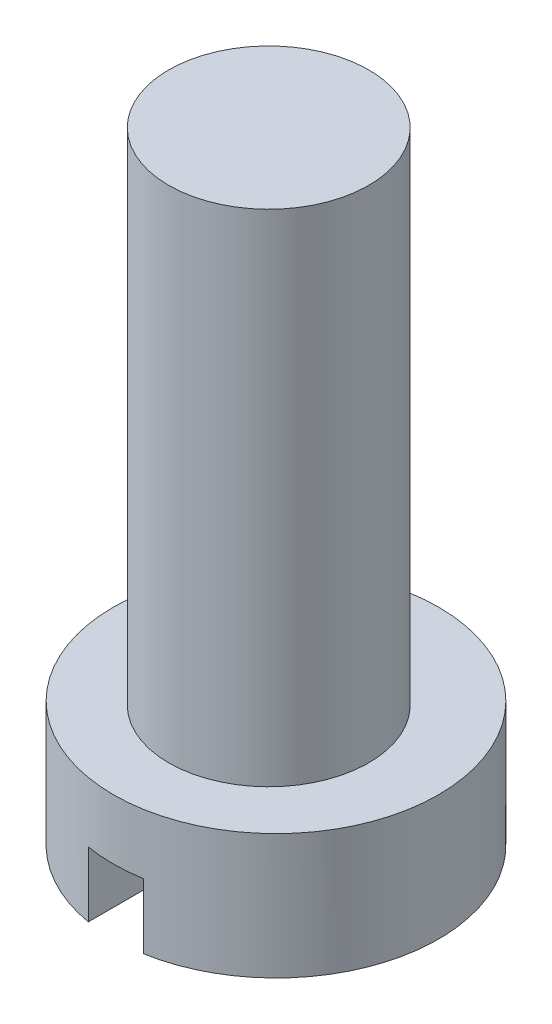
ISO-10303-21;
HEADER;
FILE_DESCRIPTION(('STEP AP214'),'2;1');
FILE_NAME('part.step','',(''),(''),'','','');
FILE_SCHEMA(('AUTOMOTIVE_DESIGN { 1 0 10303 214 1 1 1 1 }'));
ENDSEC;
DATA;
#1=APPLICATION_CONTEXT('core data for automotive mechanical design processes');
#2=APPLICATION_PROTOCOL_DEFINITION('international standard','automotive_design',2000,#1);
#3=PRODUCT_CONTEXT('',#1,'mechanical');
#4=PRODUCT('Part','Part','',(#3));
#5=PRODUCT_RELATED_PRODUCT_CATEGORY('part','',(#4));
#6=PRODUCT_DEFINITION_FORMATION('','',#4);
#7=PRODUCT_DEFINITION_CONTEXT('part definition',#1,'design');
#8=PRODUCT_DEFINITION('design','',#6,#7);
#9=PRODUCT_DEFINITION_SHAPE('','',#8);
#10=(LENGTH_UNIT() NAMED_UNIT(*) SI_UNIT(.MILLI.,.METRE.));
#11=(NAMED_UNIT(*) PLANE_ANGLE_UNIT() SI_UNIT($,.RADIAN.));
#12=(NAMED_UNIT(*) SI_UNIT($,.STERADIAN.) SOLID_ANGLE_UNIT());
#13=UNCERTAINTY_MEASURE_WITH_UNIT(LENGTH_MEASURE(1.E-05),#10,'distance_accuracy_value','');
#14=(GEOMETRIC_REPRESENTATION_CONTEXT(3) GLOBAL_UNCERTAINTY_ASSIGNED_CONTEXT((#13)) GLOBAL_UNIT_ASSIGNED_CONTEXT((#10,
#11,#12)) REPRESENTATION_CONTEXT('',''));
#15=CARTESIAN_POINT('',(0.,0.,0.));
#16=DIRECTION('',(0.,0.,1.));
#17=DIRECTION('',(1.,0.,0.));
#18=AXIS2_PLACEMENT_3D('',#15,#16,#17);
#19=CARTESIAN_POINT('',(0.,0.,0.));
#20=DIRECTION('',(0.,1.,0.));
#21=DIRECTION('',(0.,0.,1.));
#22=AXIS2_PLACEMENT_3D('',#19,#20,#21);
#23=PLANE('',#22);
#24=CARTESIAN_POINT('',(0.,0.,0.));
#25=DIRECTION('',(0.,1.,0.));
#26=DIRECTION('',(0.,0.,1.));
#27=AXIS2_PLACEMENT_3D('',#24,#25,#26);
#28=CIRCLE('',#27,6.5);
#29=CARTESIAN_POINT('',(-1.1,0.,-6.40624695121879));
#30=VERTEX_POINT('',#29);
#31=CARTESIAN_POINT('',(-1.1,0.,6.40624695121879));
#32=VERTEX_POINT('',#31);
#33=EDGE_CURVE('E92',#30,#32,#28,.T.);
#34=ORIENTED_EDGE('',*,*,#33,.F.);
#35=DIRECTION('',(0.,0.,1.));
#36=VECTOR('',#35,1.);
#37=CARTESIAN_POINT('',(-1.1,0.,0.));
#38=LINE('',#37,#36);
#39=EDGE_CURVE('E84',#30,#32,#38,.T.);
#40=ORIENTED_EDGE('',*,*,#39,.T.);
#41=EDGE_LOOP('',(#34,#40));
#42=FACE_BOUND('',#41,.T.);
#43=ADVANCED_FACE('F36',(#42),#23,.F.);
#44=CARTESIAN_POINT('',(0.,5.,0.));
#45=DIRECTION('',(0.,-1.,0.));
#46=DIRECTION('',(0.,0.,-1.));
#47=AXIS2_PLACEMENT_3D('',#44,#45,#46);
#48=CYLINDRICAL_SURFACE('',#47,6.5);
#49=CARTESIAN_POINT('',(0.,5.,0.));
#50=DIRECTION('',(0.,1.,0.));
#51=DIRECTION('',(0.,0.,1.));
#52=AXIS2_PLACEMENT_3D('',#49,#50,#51);
#53=CIRCLE('',#52,6.5);
#54=CARTESIAN_POINT('',(0.,5.,6.5));
#55=VERTEX_POINT('',#54);
#56=EDGE_CURVE('E85',#55,#55,#53,.T.);
#57=ORIENTED_EDGE('',*,*,#56,.F.);
#58=EDGE_LOOP('',(#57));
#59=FACE_BOUND('',#58,.T.);
#60=ORIENTED_EDGE('',*,*,#33,.T.);
#61=DIRECTION('',(0.,-1.,0.));
#62=VECTOR('',#61,1.);
#63=CARTESIAN_POINT('',(-1.1,5.,6.40624695121877));
#64=LINE('',#63,#62);
#65=CARTESIAN_POINT('',(-1.1,2.6,6.40624695121877));
#66=VERTEX_POINT('',#65);
#67=EDGE_CURVE('E59',#32,#66,#64,.F.);
#68=ORIENTED_EDGE('',*,*,#67,.T.);
#69=CARTESIAN_POINT('',(0.,2.6,0.));
#70=DIRECTION('',(0.,1.,0.));
#71=DIRECTION('',(0.,0.,1.));
#72=AXIS2_PLACEMENT_3D('',#69,#70,#71);
#73=CIRCLE('',#72,6.5);
#74=CARTESIAN_POINT('',(1.10000000000002,2.6,6.40624695121877));
#75=VERTEX_POINT('',#74);
#76=EDGE_CURVE('E11',#66,#75,#73,.T.);
#77=ORIENTED_EDGE('',*,*,#76,.T.);
#78=DIRECTION('',(0.,-1.,0.));
#79=VECTOR('',#78,1.);
#80=CARTESIAN_POINT('',(1.1,5.,6.40624695121877));
#81=LINE('',#80,#79);
#82=CARTESIAN_POINT('',(1.10000000000001,0.,6.40624695121879));
#83=VERTEX_POINT('',#82);
#84=EDGE_CURVE('E79',#75,#83,#81,.T.);
#85=ORIENTED_EDGE('',*,*,#84,.T.);
#86=CARTESIAN_POINT('',(1.1,0.,-6.40624695121879));
#87=VERTEX_POINT('',#86);
#88=EDGE_CURVE('E89',#83,#87,#28,.T.);
#89=ORIENTED_EDGE('',*,*,#88,.T.);
#90=DIRECTION('',(0.,-1.,0.));
#91=VECTOR('',#90,1.);
#92=CARTESIAN_POINT('',(1.10000000000001,5.,-6.40624695121879));
#93=LINE('',#92,#91);
#94=CARTESIAN_POINT('',(1.1,2.6,-6.40624695121879));
#95=VERTEX_POINT('',#94);
#96=EDGE_CURVE('E51',#87,#95,#93,.F.);
#97=ORIENTED_EDGE('',*,*,#96,.T.);
#98=CARTESIAN_POINT('',(-1.1,2.6,-6.40624695121879));
#99=VERTEX_POINT('',#98);
#100=EDGE_CURVE('E40',#95,#99,#73,.T.);
#101=ORIENTED_EDGE('',*,*,#100,.T.);
#102=DIRECTION('',(0.,-1.,0.));
#103=VECTOR('',#102,1.);
#104=CARTESIAN_POINT('',(-1.1,5.,-6.40624695121879));
#105=LINE('',#104,#103);
#106=EDGE_CURVE('E96',#99,#30,#105,.T.);
#107=ORIENTED_EDGE('',*,*,#106,.T.);
#108=EDGE_LOOP('',(#60,#68,#77,#85,#89,#97,#101,#107));
#109=FACE_BOUND('',#108,.T.);
#110=ADVANCED_FACE('F38',(#59,#109),#48,.T.);
#111=CARTESIAN_POINT('',(0.,5.,0.));
#112=DIRECTION('',(0.,1.,0.));
#113=DIRECTION('',(0.,0.,1.));
#114=AXIS2_PLACEMENT_3D('',#111,#112,#113);
#115=PLANE('',#114);
#116=CARTESIAN_POINT('',(0.,5.,0.291072269988035));
#117=DIRECTION('',(0.,1.,0.));
#118=DIRECTION('',(0.,0.,1.));
#119=AXIS2_PLACEMENT_3D('',#116,#117,#118);
#120=CIRCLE('',#119,4.);
#121=CARTESIAN_POINT('',(0.,5.,4.29107226998804));
#122=VERTEX_POINT('',#121);
#123=EDGE_CURVE('E111',#122,#122,#120,.T.);
#124=ORIENTED_EDGE('',*,*,#123,.F.);
#125=EDGE_LOOP('',(#124));
#126=FACE_BOUND('',#125,.T.);
#127=ORIENTED_EDGE('',*,*,#56,.T.);
#128=EDGE_LOOP('',(#127));
#129=FACE_BOUND('',#128,.T.);
#130=ADVANCED_FACE('F120',(#126,#129),#115,.T.);
#131=ORIENTED_EDGE('',*,*,#88,.F.);
#132=DIRECTION('',(0.,0.,-1.));
#133=VECTOR('',#132,1.);
#134=CARTESIAN_POINT('',(1.1,0.,0.));
#135=LINE('',#134,#133);
#136=EDGE_CURVE('E76',#83,#87,#135,.T.);
#137=ORIENTED_EDGE('',*,*,#136,.T.);
#138=EDGE_LOOP('',(#131,#137));
#139=FACE_BOUND('',#138,.T.);
#140=ADVANCED_FACE('F91',(#139),#23,.F.);
#141=CARTESIAN_POINT('',(-1.1,2.6,-6.95));
#142=DIRECTION('',(0.,1.,0.));
#143=DIRECTION('',(0.,0.,1.));
#144=AXIS2_PLACEMENT_3D('',#141,#142,#143);
#145=PLANE('',#144);
#146=DIRECTION('',(0.,0.,1.));
#147=VECTOR('',#146,1.);
#148=CARTESIAN_POINT('',(1.1,2.6,-6.95));
#149=LINE('',#148,#147);
#150=EDGE_CURVE('E105',#95,#75,#149,.T.);
#151=ORIENTED_EDGE('',*,*,#150,.T.);
#152=ORIENTED_EDGE('',*,*,#76,.F.);
#153=DIRECTION('',(0.,0.,1.));
#154=VECTOR('',#153,1.);
#155=CARTESIAN_POINT('',(-1.1,2.6,-6.95));
#156=LINE('',#155,#154);
#157=EDGE_CURVE('E106',#99,#66,#156,.T.);
#158=ORIENTED_EDGE('',*,*,#157,.F.);
#159=ORIENTED_EDGE('',*,*,#100,.F.);
#160=EDGE_LOOP('',(#151,#152,#158,#159));
#161=FACE_BOUND('',#160,.T.);
#162=ADVANCED_FACE('F104',(#161),#145,.F.);
#163=CARTESIAN_POINT('',(-1.1,2.6,-6.95));
#164=DIRECTION('',(-1.,0.,0.));
#165=DIRECTION('',(0.,-1.,0.));
#166=AXIS2_PLACEMENT_3D('',#163,#164,#165);
#167=PLANE('',#166);
#168=ORIENTED_EDGE('',*,*,#157,.T.);
#169=ORIENTED_EDGE('',*,*,#67,.F.);
#170=ORIENTED_EDGE('',*,*,#39,.F.);
#171=ORIENTED_EDGE('',*,*,#106,.F.);
#172=EDGE_LOOP('',(#168,#169,#170,#171));
#173=FACE_BOUND('',#172,.T.);
#174=ADVANCED_FACE('F128',(#173),#167,.F.);
#175=CARTESIAN_POINT('',(1.1,2.6,-6.95));
#176=DIRECTION('',(1.,0.,0.));
#177=DIRECTION('',(0.,1.,0.));
#178=AXIS2_PLACEMENT_3D('',#175,#176,#177);
#179=PLANE('',#178);
#180=ORIENTED_EDGE('',*,*,#150,.F.);
#181=ORIENTED_EDGE('',*,*,#96,.F.);
#182=ORIENTED_EDGE('',*,*,#136,.F.);
#183=ORIENTED_EDGE('',*,*,#84,.F.);
#184=EDGE_LOOP('',(#180,#181,#182,#183));
#185=FACE_BOUND('',#184,.T.);
#186=ADVANCED_FACE('F78',(#185),#179,.F.);
#187=CARTESIAN_POINT('',(0.,25.,0.291072269988035));
#188=DIRECTION('',(0.,-1.,0.));
#189=DIRECTION('',(0.,0.,-1.));
#190=AXIS2_PLACEMENT_3D('',#187,#188,#189);
#191=CYLINDRICAL_SURFACE('',#190,4.);
#192=CARTESIAN_POINT('',(0.,25.,0.291072269988035));
#193=DIRECTION('',(0.,1.,0.));
#194=DIRECTION('',(0.,0.,1.));
#195=AXIS2_PLACEMENT_3D('',#192,#193,#194);
#196=CIRCLE('',#195,4.);
#197=CARTESIAN_POINT('',(0.,25.,4.29107226998804));
#198=VERTEX_POINT('',#197);
#199=EDGE_CURVE('E107',#198,#198,#196,.T.);
#200=ORIENTED_EDGE('',*,*,#199,.F.);
#201=EDGE_LOOP('',(#200));
#202=FACE_BOUND('',#201,.T.);
#203=ORIENTED_EDGE('',*,*,#123,.T.);
#204=EDGE_LOOP('',(#203));
#205=FACE_BOUND('',#204,.T.);
#206=ADVANCED_FACE('F139',(#202,#205),#191,.T.);
#207=CARTESIAN_POINT('',(0.,25.,0.291072269988035));
#208=DIRECTION('',(0.,1.,0.));
#209=DIRECTION('',(0.,0.,1.));
#210=AXIS2_PLACEMENT_3D('',#207,#208,#209);
#211=PLANE('',#210);
#212=ORIENTED_EDGE('',*,*,#199,.T.);
#213=EDGE_LOOP('',(#212));
#214=FACE_BOUND('',#213,.T.);
#215=ADVANCED_FACE('F143',(#214),#211,.T.);
#216=CLOSED_SHELL('',(#43,#110,#130,#140,#162,#174,#186,#206,#215));
#217=MANIFOLD_SOLID_BREP('B2',#216);
#218=ADVANCED_BREP_SHAPE_REPRESENTATION('',(#18,#217),#14);
#219=SHAPE_DEFINITION_REPRESENTATION(#9,#218);
ENDSEC;
END-ISO-10303-21;
